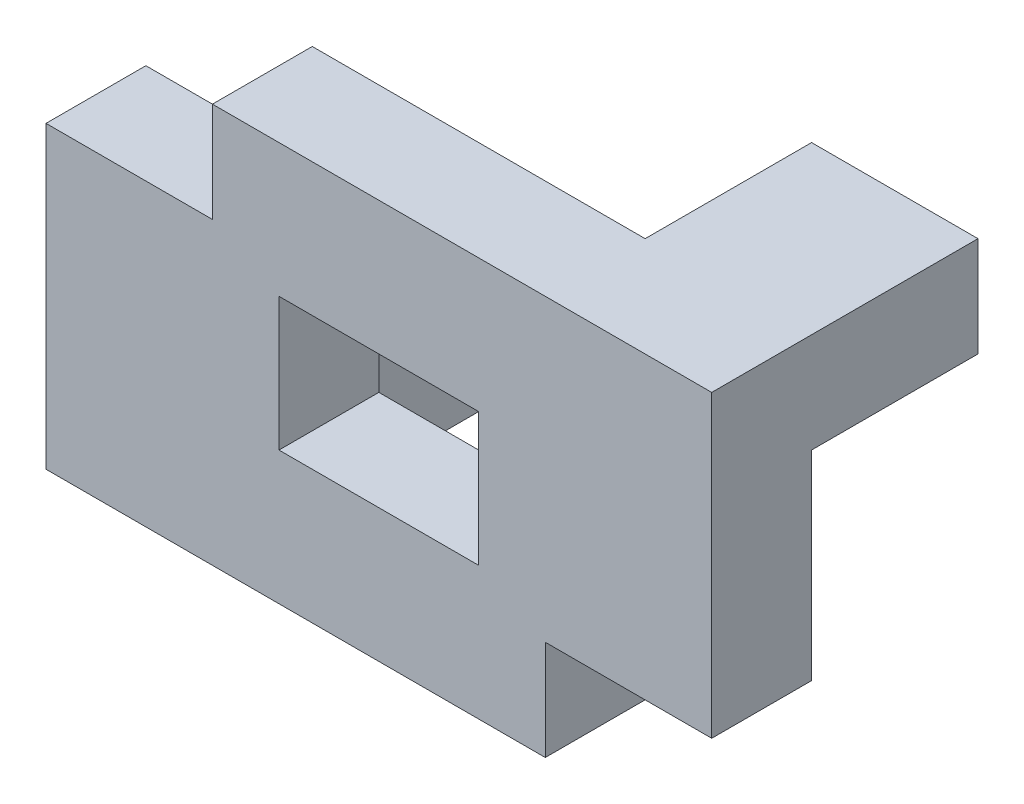
ISO-10303-21;
HEADER;
FILE_DESCRIPTION(('STEP AP214'),'2;1');
FILE_NAME('part.step','',(''),(''),'','','');
FILE_SCHEMA(('AUTOMOTIVE_DESIGN { 1 0 10303 214 1 1 1 1 }'));
ENDSEC;
DATA;
#1=APPLICATION_CONTEXT('core data for automotive mechanical design processes');
#2=APPLICATION_PROTOCOL_DEFINITION('international standard','automotive_design',2000,#1);
#3=PRODUCT_CONTEXT('',#1,'mechanical');
#4=PRODUCT('Part','Part','',(#3));
#5=PRODUCT_RELATED_PRODUCT_CATEGORY('part','',(#4));
#6=PRODUCT_DEFINITION_FORMATION('','',#4);
#7=PRODUCT_DEFINITION_CONTEXT('part definition',#1,'design');
#8=PRODUCT_DEFINITION('design','',#6,#7);
#9=PRODUCT_DEFINITION_SHAPE('','',#8);
#10=(LENGTH_UNIT() NAMED_UNIT(*) SI_UNIT(.MILLI.,.METRE.));
#11=(NAMED_UNIT(*) PLANE_ANGLE_UNIT() SI_UNIT($,.RADIAN.));
#12=(NAMED_UNIT(*) SI_UNIT($,.STERADIAN.) SOLID_ANGLE_UNIT());
#13=UNCERTAINTY_MEASURE_WITH_UNIT(LENGTH_MEASURE(1.E-05),#10,'distance_accuracy_value','');
#14=(GEOMETRIC_REPRESENTATION_CONTEXT(3) GLOBAL_UNCERTAINTY_ASSIGNED_CONTEXT((#13)) GLOBAL_UNIT_ASSIGNED_CONTEXT((#10,
#11,#12)) REPRESENTATION_CONTEXT('',''));
#15=CARTESIAN_POINT('',(0.,0.,0.));
#16=DIRECTION('',(0.,0.,1.));
#17=DIRECTION('',(1.,0.,0.));
#18=AXIS2_PLACEMENT_3D('',#15,#16,#17);
#19=CARTESIAN_POINT('',(0.,0.,0.));
#20=DIRECTION('',(0.,0.,1.));
#21=DIRECTION('',(1.,0.,0.));
#22=AXIS2_PLACEMENT_3D('',#19,#20,#21);
#23=PLANE('',#22);
#24=DIRECTION('',(-1.,0.,0.));
#25=VECTOR('',#24,1.);
#26=CARTESIAN_POINT('',(15.,-10.,0.));
#27=LINE('',#26,#25);
#28=CARTESIAN_POINT('',(15.,-10.,0.));
#29=VERTEX_POINT('',#28);
#30=CARTESIAN_POINT('',(-15.,-10.,0.));
#31=VERTEX_POINT('',#30);
#32=EDGE_CURVE('E183',#29,#31,#27,.T.);
#33=ORIENTED_EDGE('',*,*,#32,.F.);
#34=DIRECTION('',(0.,-1.,0.));
#35=VECTOR('',#34,1.);
#36=CARTESIAN_POINT('',(15.,10.,0.));
#37=LINE('',#36,#35);
#38=CARTESIAN_POINT('',(15.,10.,0.));
#39=VERTEX_POINT('',#38);
#40=EDGE_CURVE('E61',#39,#29,#37,.T.);
#41=ORIENTED_EDGE('',*,*,#40,.F.);
#42=DIRECTION('',(1.,0.,0.));
#43=VECTOR('',#42,1.);
#44=CARTESIAN_POINT('',(15.,10.,0.));
#45=LINE('',#44,#43);
#46=CARTESIAN_POINT('',(-15.,10.,0.));
#47=VERTEX_POINT('',#46);
#48=EDGE_CURVE('E190',#47,#39,#45,.T.);
#49=ORIENTED_EDGE('',*,*,#48,.F.);
#50=DIRECTION('',(0.,1.,0.));
#51=VECTOR('',#50,1.);
#52=CARTESIAN_POINT('',(-15.,10.,0.));
#53=LINE('',#52,#51);
#54=EDGE_CURVE('E173',#31,#47,#53,.T.);
#55=ORIENTED_EDGE('',*,*,#54,.F.);
#56=EDGE_LOOP('',(#33,#41,#49,#55));
#57=FACE_BOUND('',#56,.T.);
#58=DIRECTION('',(0.,-1.,0.));
#59=VECTOR('',#58,1.);
#60=CARTESIAN_POINT('',(50.,30.,0.));
#61=LINE('',#60,#59);
#62=CARTESIAN_POINT('',(50.,15.,0.));
#63=VERTEX_POINT('',#62);
#64=CARTESIAN_POINT('',(50.,-15.,0.));
#65=VERTEX_POINT('',#64);
#66=EDGE_CURVE('E327',#63,#65,#61,.T.);
#67=ORIENTED_EDGE('',*,*,#66,.T.);
#68=DIRECTION('',(1.,0.,0.));
#69=VECTOR('',#68,1.);
#70=CARTESIAN_POINT('',(50.,-15.,0.));
#71=LINE('',#70,#69);
#72=CARTESIAN_POINT('',(25.,-15.,0.));
#73=VERTEX_POINT('',#72);
#74=EDGE_CURVE('E209',#73,#65,#71,.T.);
#75=ORIENTED_EDGE('',*,*,#74,.F.);
#76=DIRECTION('',(0.,1.,0.));
#77=VECTOR('',#76,1.);
#78=CARTESIAN_POINT('',(25.,-30.,0.));
#79=LINE('',#78,#77);
#80=CARTESIAN_POINT('',(25.,-30.,0.));
#81=VERTEX_POINT('',#80);
#82=EDGE_CURVE('E205',#81,#73,#79,.T.);
#83=ORIENTED_EDGE('',*,*,#82,.F.);
#84=DIRECTION('',(1.,0.,0.));
#85=VECTOR('',#84,1.);
#86=CARTESIAN_POINT('',(-50.,-30.,0.));
#87=LINE('',#86,#85);
#88=CARTESIAN_POINT('',(-25.,-30.,0.));
#89=VERTEX_POINT('',#88);
#90=EDGE_CURVE('E323',#89,#81,#87,.T.);
#91=ORIENTED_EDGE('',*,*,#90,.F.);
#92=DIRECTION('',(0.,-1.,0.));
#93=VECTOR('',#92,1.);
#94=CARTESIAN_POINT('',(-25.,-30.,0.));
#95=LINE('',#94,#93);
#96=CARTESIAN_POINT('',(-25.,-15.,0.));
#97=VERTEX_POINT('',#96);
#98=EDGE_CURVE('E250',#97,#89,#95,.T.);
#99=ORIENTED_EDGE('',*,*,#98,.F.);
#100=DIRECTION('',(1.,0.,0.));
#101=VECTOR('',#100,1.);
#102=CARTESIAN_POINT('',(-50.,-15.,0.));
#103=LINE('',#102,#101);
#104=CARTESIAN_POINT('',(-50.,-15.,0.));
#105=VERTEX_POINT('',#104);
#106=EDGE_CURVE('E254',#105,#97,#103,.T.);
#107=ORIENTED_EDGE('',*,*,#106,.F.);
#108=DIRECTION('',(0.,-1.,0.));
#109=VECTOR('',#108,1.);
#110=CARTESIAN_POINT('',(-50.,30.,0.));
#111=LINE('',#110,#109);
#112=CARTESIAN_POINT('',(-50.,15.,0.));
#113=VERTEX_POINT('',#112);
#114=EDGE_CURVE('E304',#113,#105,#111,.T.);
#115=ORIENTED_EDGE('',*,*,#114,.F.);
#116=DIRECTION('',(-1.,0.,0.));
#117=VECTOR('',#116,1.);
#118=CARTESIAN_POINT('',(-50.,15.,0.));
#119=LINE('',#118,#117);
#120=CARTESIAN_POINT('',(-25.,15.,0.));
#121=VERTEX_POINT('',#120);
#122=EDGE_CURVE('E227',#121,#113,#119,.T.);
#123=ORIENTED_EDGE('',*,*,#122,.F.);
#124=DIRECTION('',(0.,-1.,0.));
#125=VECTOR('',#124,1.);
#126=CARTESIAN_POINT('',(-25.,30.,0.));
#127=LINE('',#126,#125);
#128=CARTESIAN_POINT('',(-25.,30.,0.));
#129=VERTEX_POINT('',#128);
#130=EDGE_CURVE('E210',#129,#121,#127,.T.);
#131=ORIENTED_EDGE('',*,*,#130,.F.);
#132=DIRECTION('',(1.,0.,0.));
#133=VECTOR('',#132,1.);
#134=CARTESIAN_POINT('',(-50.,30.,0.));
#135=LINE('',#134,#133);
#136=CARTESIAN_POINT('',(25.,30.,0.));
#137=VERTEX_POINT('',#136);
#138=EDGE_CURVE('E309',#129,#137,#135,.T.);
#139=ORIENTED_EDGE('',*,*,#138,.T.);
#140=DIRECTION('',(0.,1.,0.));
#141=VECTOR('',#140,1.);
#142=CARTESIAN_POINT('',(25.,30.,0.));
#143=LINE('',#142,#141);
#144=CARTESIAN_POINT('',(25.,15.,0.));
#145=VERTEX_POINT('',#144);
#146=EDGE_CURVE('E276',#145,#137,#143,.T.);
#147=ORIENTED_EDGE('',*,*,#146,.F.);
#148=DIRECTION('',(-1.,0.,0.));
#149=VECTOR('',#148,1.);
#150=CARTESIAN_POINT('',(50.,15.,0.));
#151=LINE('',#150,#149);
#152=EDGE_CURVE('E258',#63,#145,#151,.T.);
#153=ORIENTED_EDGE('',*,*,#152,.F.);
#154=EDGE_LOOP('',(#67,#75,#83,#91,#99,#107,#115,#123,#131,#139,#147,#153));
#155=FACE_BOUND('',#154,.T.);
#156=ADVANCED_FACE('F45',(#57,#155),#23,.F.);
#157=CARTESIAN_POINT('',(-50.,30.,15.));
#158=DIRECTION('',(1.,0.,0.));
#159=DIRECTION('',(0.,1.,0.));
#160=AXIS2_PLACEMENT_3D('',#157,#158,#159);
#161=PLANE('',#160);
#162=DIRECTION('',(0.,-1.,0.));
#163=VECTOR('',#162,1.);
#164=CARTESIAN_POINT('',(-50.,30.,15.));
#165=LINE('',#164,#163);
#166=CARTESIAN_POINT('',(-50.,15.,15.));
#167=VERTEX_POINT('',#166);
#168=CARTESIAN_POINT('',(-50.,-30.,15.));
#169=VERTEX_POINT('',#168);
#170=EDGE_CURVE('E305',#167,#169,#165,.T.);
#171=ORIENTED_EDGE('',*,*,#170,.F.);
#172=DIRECTION('',(0.,0.,-1.));
#173=VECTOR('',#172,1.);
#174=CARTESIAN_POINT('',(-50.,15.,25.));
#175=LINE('',#174,#173);
#176=EDGE_CURVE('E200',#167,#113,#175,.T.);
#177=ORIENTED_EDGE('',*,*,#176,.T.);
#178=ORIENTED_EDGE('',*,*,#114,.T.);
#179=DIRECTION('',(0.,0.,1.));
#180=VECTOR('',#179,1.);
#181=CARTESIAN_POINT('',(-50.,-15.,-25.));
#182=LINE('',#181,#180);
#183=CARTESIAN_POINT('',(-50.,-15.,-25.));
#184=VERTEX_POINT('',#183);
#185=EDGE_CURVE('E218',#184,#105,#182,.T.);
#186=ORIENTED_EDGE('',*,*,#185,.F.);
#187=DIRECTION('',(0.,1.,0.));
#188=VECTOR('',#187,1.);
#189=CARTESIAN_POINT('',(-50.,-30.,-25.));
#190=LINE('',#189,#188);
#191=CARTESIAN_POINT('',(-50.,-30.,-25.));
#192=VERTEX_POINT('',#191);
#193=EDGE_CURVE('E255',#192,#184,#190,.T.);
#194=ORIENTED_EDGE('',*,*,#193,.F.);
#195=DIRECTION('',(0.,0.,-1.));
#196=VECTOR('',#195,1.);
#197=CARTESIAN_POINT('',(-50.,-30.,15.));
#198=LINE('',#197,#196);
#199=EDGE_CURVE('E335',#169,#192,#198,.T.);
#200=ORIENTED_EDGE('',*,*,#199,.F.);
#201=EDGE_LOOP('',(#171,#177,#178,#186,#194,#200));
#202=FACE_BOUND('',#201,.T.);
#203=ADVANCED_FACE('F47',(#202),#161,.F.);
#204=CARTESIAN_POINT('',(-50.,-30.,15.));
#205=DIRECTION('',(0.,1.,0.));
#206=DIRECTION('',(0.,0.,1.));
#207=AXIS2_PLACEMENT_3D('',#204,#205,#206);
#208=PLANE('',#207);
#209=ORIENTED_EDGE('',*,*,#90,.T.);
#210=DIRECTION('',(0.,0.,-1.));
#211=VECTOR('',#210,1.);
#212=CARTESIAN_POINT('',(25.,-30.,25.));
#213=LINE('',#212,#211);
#214=CARTESIAN_POINT('',(25.,-30.,15.));
#215=VERTEX_POINT('',#214);
#216=EDGE_CURVE('E213',#215,#81,#213,.T.);
#217=ORIENTED_EDGE('',*,*,#216,.F.);
#218=DIRECTION('',(1.,0.,0.));
#219=VECTOR('',#218,1.);
#220=CARTESIAN_POINT('',(-50.,-30.,15.));
#221=LINE('',#220,#219);
#222=EDGE_CURVE('E308',#169,#215,#221,.T.);
#223=ORIENTED_EDGE('',*,*,#222,.F.);
#224=ORIENTED_EDGE('',*,*,#199,.T.);
#225=DIRECTION('',(-1.,0.,0.));
#226=VECTOR('',#225,1.);
#227=CARTESIAN_POINT('',(-50.,-30.,-25.));
#228=LINE('',#227,#226);
#229=CARTESIAN_POINT('',(-25.,-30.,-25.));
#230=VERTEX_POINT('',#229);
#231=EDGE_CURVE('E249',#230,#192,#228,.T.);
#232=ORIENTED_EDGE('',*,*,#231,.F.);
#233=DIRECTION('',(0.,0.,1.));
#234=VECTOR('',#233,1.);
#235=CARTESIAN_POINT('',(-25.,-30.,-25.));
#236=LINE('',#235,#234);
#237=EDGE_CURVE('E246',#230,#89,#236,.T.);
#238=ORIENTED_EDGE('',*,*,#237,.T.);
#239=EDGE_LOOP('',(#209,#217,#223,#224,#232,#238));
#240=FACE_BOUND('',#239,.T.);
#241=ADVANCED_FACE('F386',(#240),#208,.F.);
#242=CARTESIAN_POINT('',(50.,30.,15.));
#243=DIRECTION('',(1.,0.,0.));
#244=DIRECTION('',(0.,1.,0.));
#245=AXIS2_PLACEMENT_3D('',#242,#243,#244);
#246=PLANE('',#245);
#247=DIRECTION('',(0.,0.,-1.));
#248=VECTOR('',#247,1.);
#249=CARTESIAN_POINT('',(50.,-15.,25.));
#250=LINE('',#249,#248);
#251=CARTESIAN_POINT('',(50.,-15.,15.));
#252=VERTEX_POINT('',#251);
#253=EDGE_CURVE('E214',#252,#65,#250,.T.);
#254=ORIENTED_EDGE('',*,*,#253,.T.);
#255=ORIENTED_EDGE('',*,*,#66,.F.);
#256=DIRECTION('',(0.,0.,1.));
#257=VECTOR('',#256,1.);
#258=CARTESIAN_POINT('',(50.,15.,-25.));
#259=LINE('',#258,#257);
#260=CARTESIAN_POINT('',(50.,15.,-25.));
#261=VERTEX_POINT('',#260);
#262=EDGE_CURVE('E300',#261,#63,#259,.T.);
#263=ORIENTED_EDGE('',*,*,#262,.F.);
#264=DIRECTION('',(0.,-1.,0.));
#265=VECTOR('',#264,1.);
#266=CARTESIAN_POINT('',(50.,30.,-25.));
#267=LINE('',#266,#265);
#268=CARTESIAN_POINT('',(50.,30.,-25.));
#269=VERTEX_POINT('',#268);
#270=EDGE_CURVE('E271',#269,#261,#267,.T.);
#271=ORIENTED_EDGE('',*,*,#270,.F.);
#272=DIRECTION('',(0.,0.,-1.));
#273=VECTOR('',#272,1.);
#274=CARTESIAN_POINT('',(50.,30.,15.));
#275=LINE('',#274,#273);
#276=CARTESIAN_POINT('',(50.,30.,15.));
#277=VERTEX_POINT('',#276);
#278=EDGE_CURVE('E320',#277,#269,#275,.T.);
#279=ORIENTED_EDGE('',*,*,#278,.F.);
#280=DIRECTION('',(0.,-1.,0.));
#281=VECTOR('',#280,1.);
#282=CARTESIAN_POINT('',(50.,30.,15.));
#283=LINE('',#282,#281);
#284=EDGE_CURVE('E313',#277,#252,#283,.T.);
#285=ORIENTED_EDGE('',*,*,#284,.T.);
#286=EDGE_LOOP('',(#254,#255,#263,#271,#279,#285));
#287=FACE_BOUND('',#286,.T.);
#288=ADVANCED_FACE('F394',(#287),#246,.T.);
#289=CARTESIAN_POINT('',(-50.,30.,15.));
#290=DIRECTION('',(0.,1.,0.));
#291=DIRECTION('',(0.,0.,1.));
#292=AXIS2_PLACEMENT_3D('',#289,#290,#291);
#293=PLANE('',#292);
#294=DIRECTION('',(0.,0.,-1.));
#295=VECTOR('',#294,1.);
#296=CARTESIAN_POINT('',(-25.,30.,25.));
#297=LINE('',#296,#295);
#298=CARTESIAN_POINT('',(-25.,30.,15.));
#299=VERTEX_POINT('',#298);
#300=EDGE_CURVE('E224',#299,#129,#297,.T.);
#301=ORIENTED_EDGE('',*,*,#300,.F.);
#302=DIRECTION('',(1.,0.,0.));
#303=VECTOR('',#302,1.);
#304=CARTESIAN_POINT('',(-50.,30.,15.));
#305=LINE('',#304,#303);
#306=EDGE_CURVE('E317',#299,#277,#305,.T.);
#307=ORIENTED_EDGE('',*,*,#306,.T.);
#308=ORIENTED_EDGE('',*,*,#278,.T.);
#309=DIRECTION('',(1.,0.,0.));
#310=VECTOR('',#309,1.);
#311=CARTESIAN_POINT('',(50.,30.,-25.));
#312=LINE('',#311,#310);
#313=CARTESIAN_POINT('',(25.,30.,-25.));
#314=VERTEX_POINT('',#313);
#315=EDGE_CURVE('E282',#314,#269,#312,.T.);
#316=ORIENTED_EDGE('',*,*,#315,.F.);
#317=DIRECTION('',(0.,0.,1.));
#318=VECTOR('',#317,1.);
#319=CARTESIAN_POINT('',(25.,30.,-25.));
#320=LINE('',#319,#318);
#321=EDGE_CURVE('E286',#314,#137,#320,.T.);
#322=ORIENTED_EDGE('',*,*,#321,.T.);
#323=ORIENTED_EDGE('',*,*,#138,.F.);
#324=EDGE_LOOP('',(#301,#307,#308,#316,#322,#323));
#325=FACE_BOUND('',#324,.T.);
#326=ADVANCED_FACE('F391',(#325),#293,.T.);
#327=CARTESIAN_POINT('',(0.,0.,15.));
#328=DIRECTION('',(0.,0.,1.));
#329=DIRECTION('',(1.,0.,0.));
#330=AXIS2_PLACEMENT_3D('',#327,#328,#329);
#331=PLANE('',#330);
#332=DIRECTION('',(0.,1.,0.));
#333=VECTOR('',#332,1.);
#334=CARTESIAN_POINT('',(15.,0.,15.));
#335=LINE('',#334,#333);
#336=CARTESIAN_POINT('',(15.,-10.,15.));
#337=VERTEX_POINT('',#336);
#338=CARTESIAN_POINT('',(15.,10.,15.));
#339=VERTEX_POINT('',#338);
#340=EDGE_CURVE('E11',#337,#339,#335,.T.);
#341=ORIENTED_EDGE('',*,*,#340,.F.);
#342=DIRECTION('',(1.,0.,0.));
#343=VECTOR('',#342,1.);
#344=CARTESIAN_POINT('',(0.,-10.,15.));
#345=LINE('',#344,#343);
#346=CARTESIAN_POINT('',(-15.,-10.,15.));
#347=VERTEX_POINT('',#346);
#348=EDGE_CURVE('E352',#347,#337,#345,.T.);
#349=ORIENTED_EDGE('',*,*,#348,.F.);
#350=DIRECTION('',(0.,-1.,0.));
#351=VECTOR('',#350,1.);
#352=CARTESIAN_POINT('',(-15.,0.,15.));
#353=LINE('',#352,#351);
#354=CARTESIAN_POINT('',(-15.,10.,15.));
#355=VERTEX_POINT('',#354);
#356=EDGE_CURVE('E176',#355,#347,#353,.T.);
#357=ORIENTED_EDGE('',*,*,#356,.F.);
#358=DIRECTION('',(-1.,0.,0.));
#359=VECTOR('',#358,1.);
#360=CARTESIAN_POINT('',(0.,10.,15.));
#361=LINE('',#360,#359);
#362=EDGE_CURVE('E54',#339,#355,#361,.T.);
#363=ORIENTED_EDGE('',*,*,#362,.F.);
#364=EDGE_LOOP('',(#341,#349,#357,#363));
#365=FACE_BOUND('',#364,.T.);
#366=DIRECTION('',(-1.,0.,0.));
#367=VECTOR('',#366,1.);
#368=CARTESIAN_POINT('',(0.,-15.,15.));
#369=LINE('',#368,#367);
#370=CARTESIAN_POINT('',(25.,-15.,15.));
#371=VERTEX_POINT('',#370);
#372=EDGE_CURVE('E348',#252,#371,#369,.T.);
#373=ORIENTED_EDGE('',*,*,#372,.F.);
#374=ORIENTED_EDGE('',*,*,#284,.F.);
#375=ORIENTED_EDGE('',*,*,#306,.F.);
#376=DIRECTION('',(0.,1.,0.));
#377=VECTOR('',#376,1.);
#378=CARTESIAN_POINT('',(-25.,0.,15.));
#379=LINE('',#378,#377);
#380=CARTESIAN_POINT('',(-25.,15.,15.));
#381=VERTEX_POINT('',#380);
#382=EDGE_CURVE('E338',#381,#299,#379,.T.);
#383=ORIENTED_EDGE('',*,*,#382,.F.);
#384=DIRECTION('',(1.,0.,0.));
#385=VECTOR('',#384,1.);
#386=CARTESIAN_POINT('',(0.,15.,15.));
#387=LINE('',#386,#385);
#388=EDGE_CURVE('E341',#167,#381,#387,.T.);
#389=ORIENTED_EDGE('',*,*,#388,.F.);
#390=ORIENTED_EDGE('',*,*,#170,.T.);
#391=ORIENTED_EDGE('',*,*,#222,.T.);
#392=DIRECTION('',(0.,-1.,0.));
#393=VECTOR('',#392,1.);
#394=CARTESIAN_POINT('',(25.,0.,15.));
#395=LINE('',#394,#393);
#396=EDGE_CURVE('E345',#371,#215,#395,.T.);
#397=ORIENTED_EDGE('',*,*,#396,.F.);
#398=EDGE_LOOP('',(#373,#374,#375,#383,#389,#390,#391,#397));
#399=FACE_BOUND('',#398,.T.);
#400=ADVANCED_FACE('F363',(#365,#399),#331,.T.);
#401=CARTESIAN_POINT('',(50.,15.,-25.));
#402=DIRECTION('',(0.,1.,0.));
#403=DIRECTION('',(0.,0.,1.));
#404=AXIS2_PLACEMENT_3D('',#401,#402,#403);
#405=PLANE('',#404);
#406=ORIENTED_EDGE('',*,*,#152,.T.);
#407=DIRECTION('',(0.,0.,1.));
#408=VECTOR('',#407,1.);
#409=CARTESIAN_POINT('',(25.,15.,-25.));
#410=LINE('',#409,#408);
#411=CARTESIAN_POINT('',(25.,15.,-25.));
#412=VERTEX_POINT('',#411);
#413=EDGE_CURVE('E296',#412,#145,#410,.T.);
#414=ORIENTED_EDGE('',*,*,#413,.F.);
#415=DIRECTION('',(-1.,0.,0.));
#416=VECTOR('',#415,1.);
#417=CARTESIAN_POINT('',(50.,15.,-25.));
#418=LINE('',#417,#416);
#419=EDGE_CURVE('E275',#261,#412,#418,.T.);
#420=ORIENTED_EDGE('',*,*,#419,.F.);
#421=ORIENTED_EDGE('',*,*,#262,.T.);
#422=EDGE_LOOP('',(#406,#414,#420,#421));
#423=FACE_BOUND('',#422,.T.);
#424=ADVANCED_FACE('F446',(#423),#405,.F.);
#425=CARTESIAN_POINT('',(25.,30.,-25.));
#426=DIRECTION('',(1.,0.,0.));
#427=DIRECTION('',(0.,1.,0.));
#428=AXIS2_PLACEMENT_3D('',#425,#426,#427);
#429=PLANE('',#428);
#430=ORIENTED_EDGE('',*,*,#146,.T.);
#431=ORIENTED_EDGE('',*,*,#321,.F.);
#432=DIRECTION('',(0.,1.,0.));
#433=VECTOR('',#432,1.);
#434=CARTESIAN_POINT('',(25.,30.,-25.));
#435=LINE('',#434,#433);
#436=EDGE_CURVE('E279',#412,#314,#435,.T.);
#437=ORIENTED_EDGE('',*,*,#436,.F.);
#438=ORIENTED_EDGE('',*,*,#413,.T.);
#439=EDGE_LOOP('',(#430,#431,#437,#438));
#440=FACE_BOUND('',#439,.T.);
#441=ADVANCED_FACE('F442',(#440),#429,.F.);
#442=CARTESIAN_POINT('',(0.,0.,-25.));
#443=DIRECTION('',(0.,0.,-1.));
#444=DIRECTION('',(-1.,0.,0.));
#445=AXIS2_PLACEMENT_3D('',#442,#443,#444);
#446=PLANE('',#445);
#447=ORIENTED_EDGE('',*,*,#270,.T.);
#448=ORIENTED_EDGE('',*,*,#419,.T.);
#449=ORIENTED_EDGE('',*,*,#436,.T.);
#450=ORIENTED_EDGE('',*,*,#315,.T.);
#451=EDGE_LOOP('',(#447,#448,#449,#450));
#452=FACE_BOUND('',#451,.T.);
#453=ADVANCED_FACE('F461',(#452),#446,.T.);
#454=CARTESIAN_POINT('',(-50.,-15.,-25.));
#455=DIRECTION('',(0.,-1.,0.));
#456=DIRECTION('',(1.,0.,0.));
#457=AXIS2_PLACEMENT_3D('',#454,#455,#456);
#458=PLANE('',#457);
#459=ORIENTED_EDGE('',*,*,#106,.T.);
#460=DIRECTION('',(0.,0.,1.));
#461=VECTOR('',#460,1.);
#462=CARTESIAN_POINT('',(-25.,-15.,-25.));
#463=LINE('',#462,#461);
#464=CARTESIAN_POINT('',(-25.,-15.,-25.));
#465=VERTEX_POINT('',#464);
#466=EDGE_CURVE('E242',#465,#97,#463,.T.);
#467=ORIENTED_EDGE('',*,*,#466,.F.);
#468=DIRECTION('',(1.,0.,0.));
#469=VECTOR('',#468,1.);
#470=CARTESIAN_POINT('',(-50.,-15.,-25.));
#471=LINE('',#470,#469);
#472=EDGE_CURVE('E265',#184,#465,#471,.T.);
#473=ORIENTED_EDGE('',*,*,#472,.F.);
#474=ORIENTED_EDGE('',*,*,#185,.T.);
#475=EDGE_LOOP('',(#459,#467,#473,#474));
#476=FACE_BOUND('',#475,.T.);
#477=ADVANCED_FACE('F426',(#476),#458,.F.);
#478=CARTESIAN_POINT('',(-25.,-30.,-25.));
#479=DIRECTION('',(-1.,0.,0.));
#480=DIRECTION('',(0.,0.,1.));
#481=AXIS2_PLACEMENT_3D('',#478,#479,#480);
#482=PLANE('',#481);
#483=ORIENTED_EDGE('',*,*,#98,.T.);
#484=ORIENTED_EDGE('',*,*,#237,.F.);
#485=DIRECTION('',(0.,-1.,0.));
#486=VECTOR('',#485,1.);
#487=CARTESIAN_POINT('',(-25.,-30.,-25.));
#488=LINE('',#487,#486);
#489=EDGE_CURVE('E262',#465,#230,#488,.T.);
#490=ORIENTED_EDGE('',*,*,#489,.F.);
#491=ORIENTED_EDGE('',*,*,#466,.T.);
#492=EDGE_LOOP('',(#483,#484,#490,#491));
#493=FACE_BOUND('',#492,.T.);
#494=ADVANCED_FACE('F424',(#493),#482,.F.);
#495=CARTESIAN_POINT('',(0.,0.,-25.));
#496=DIRECTION('',(0.,0.,-1.));
#497=DIRECTION('',(-1.,0.,0.));
#498=AXIS2_PLACEMENT_3D('',#495,#496,#497);
#499=PLANE('',#498);
#500=ORIENTED_EDGE('',*,*,#193,.T.);
#501=ORIENTED_EDGE('',*,*,#472,.T.);
#502=ORIENTED_EDGE('',*,*,#489,.T.);
#503=ORIENTED_EDGE('',*,*,#231,.T.);
#504=EDGE_LOOP('',(#500,#501,#502,#503));
#505=FACE_BOUND('',#504,.T.);
#506=ADVANCED_FACE('F420',(#505),#499,.T.);
#507=CARTESIAN_POINT('',(-50.,15.,25.));
#508=DIRECTION('',(0.,-1.,0.));
#509=DIRECTION('',(1.,0.,0.));
#510=AXIS2_PLACEMENT_3D('',#507,#508,#509);
#511=PLANE('',#510);
#512=ORIENTED_EDGE('',*,*,#388,.T.);
#513=DIRECTION('',(0.,0.,-1.));
#514=VECTOR('',#513,1.);
#515=CARTESIAN_POINT('',(-25.,15.,25.));
#516=LINE('',#515,#514);
#517=EDGE_CURVE('E228',#381,#121,#516,.T.);
#518=ORIENTED_EDGE('',*,*,#517,.T.);
#519=ORIENTED_EDGE('',*,*,#122,.T.);
#520=ORIENTED_EDGE('',*,*,#176,.F.);
#521=EDGE_LOOP('',(#512,#518,#519,#520));
#522=FACE_BOUND('',#521,.T.);
#523=ADVANCED_FACE('F431',(#522),#511,.F.);
#524=CARTESIAN_POINT('',(-25.,30.,25.));
#525=DIRECTION('',(1.,0.,0.));
#526=DIRECTION('',(0.,0.,-1.));
#527=AXIS2_PLACEMENT_3D('',#524,#525,#526);
#528=PLANE('',#527);
#529=ORIENTED_EDGE('',*,*,#382,.T.);
#530=ORIENTED_EDGE('',*,*,#300,.T.);
#531=ORIENTED_EDGE('',*,*,#130,.T.);
#532=ORIENTED_EDGE('',*,*,#517,.F.);
#533=EDGE_LOOP('',(#529,#530,#531,#532));
#534=FACE_BOUND('',#533,.T.);
#535=ADVANCED_FACE('F436',(#534),#528,.F.);
#536=CARTESIAN_POINT('',(50.,-15.,25.));
#537=DIRECTION('',(0.,1.,0.));
#538=DIRECTION('',(0.,0.,1.));
#539=AXIS2_PLACEMENT_3D('',#536,#537,#538);
#540=PLANE('',#539);
#541=ORIENTED_EDGE('',*,*,#372,.T.);
#542=DIRECTION('',(0.,0.,-1.));
#543=VECTOR('',#542,1.);
#544=CARTESIAN_POINT('',(25.,-15.,25.));
#545=LINE('',#544,#543);
#546=EDGE_CURVE('E219',#371,#73,#545,.T.);
#547=ORIENTED_EDGE('',*,*,#546,.T.);
#548=ORIENTED_EDGE('',*,*,#74,.T.);
#549=ORIENTED_EDGE('',*,*,#253,.F.);
#550=EDGE_LOOP('',(#541,#547,#548,#549));
#551=FACE_BOUND('',#550,.T.);
#552=ADVANCED_FACE('F376',(#551),#540,.F.);
#553=CARTESIAN_POINT('',(25.,-30.,25.));
#554=DIRECTION('',(-1.,0.,0.));
#555=DIRECTION('',(0.,0.,1.));
#556=AXIS2_PLACEMENT_3D('',#553,#554,#555);
#557=PLANE('',#556);
#558=ORIENTED_EDGE('',*,*,#396,.T.);
#559=ORIENTED_EDGE('',*,*,#216,.T.);
#560=ORIENTED_EDGE('',*,*,#82,.T.);
#561=ORIENTED_EDGE('',*,*,#546,.F.);
#562=EDGE_LOOP('',(#558,#559,#560,#561));
#563=FACE_BOUND('',#562,.T.);
#564=ADVANCED_FACE('F368',(#563),#557,.F.);
#565=CARTESIAN_POINT('',(15.,10.,25.));
#566=DIRECTION('',(1.,0.,0.));
#567=DIRECTION('',(0.,1.,0.));
#568=AXIS2_PLACEMENT_3D('',#565,#566,#567);
#569=PLANE('',#568);
#570=ORIENTED_EDGE('',*,*,#340,.T.);
#571=DIRECTION('',(0.,0.,-1.));
#572=VECTOR('',#571,1.);
#573=CARTESIAN_POINT('',(15.,10.,25.));
#574=LINE('',#573,#572);
#575=EDGE_CURVE('E197',#339,#39,#574,.T.);
#576=ORIENTED_EDGE('',*,*,#575,.T.);
#577=ORIENTED_EDGE('',*,*,#40,.T.);
#578=DIRECTION('',(0.,0.,-1.));
#579=VECTOR('',#578,1.);
#580=CARTESIAN_POINT('',(15.,-10.,25.));
#581=LINE('',#580,#579);
#582=EDGE_CURVE('E180',#337,#29,#581,.T.);
#583=ORIENTED_EDGE('',*,*,#582,.F.);
#584=EDGE_LOOP('',(#570,#576,#577,#583));
#585=FACE_BOUND('',#584,.T.);
#586=ADVANCED_FACE('F365',(#585),#569,.F.);
#587=CARTESIAN_POINT('',(15.,10.,25.));
#588=DIRECTION('',(0.,1.,0.));
#589=DIRECTION('',(0.,0.,1.));
#590=AXIS2_PLACEMENT_3D('',#587,#588,#589);
#591=PLANE('',#590);
#592=ORIENTED_EDGE('',*,*,#362,.T.);
#593=DIRECTION('',(0.,0.,-1.));
#594=VECTOR('',#593,1.);
#595=CARTESIAN_POINT('',(-15.,10.,25.));
#596=LINE('',#595,#594);
#597=EDGE_CURVE('E179',#355,#47,#596,.T.);
#598=ORIENTED_EDGE('',*,*,#597,.T.);
#599=ORIENTED_EDGE('',*,*,#48,.T.);
#600=ORIENTED_EDGE('',*,*,#575,.F.);
#601=EDGE_LOOP('',(#592,#598,#599,#600));
#602=FACE_BOUND('',#601,.T.);
#603=ADVANCED_FACE('F360',(#602),#591,.F.);
#604=CARTESIAN_POINT('',(-15.,10.,25.));
#605=DIRECTION('',(-1.,0.,0.));
#606=DIRECTION('',(0.,-1.,0.));
#607=AXIS2_PLACEMENT_3D('',#604,#605,#606);
#608=PLANE('',#607);
#609=ORIENTED_EDGE('',*,*,#356,.T.);
#610=DIRECTION('',(0.,0.,-1.));
#611=VECTOR('',#610,1.);
#612=CARTESIAN_POINT('',(-15.,-10.,25.));
#613=LINE('',#612,#611);
#614=EDGE_CURVE('E69',#347,#31,#613,.T.);
#615=ORIENTED_EDGE('',*,*,#614,.T.);
#616=ORIENTED_EDGE('',*,*,#54,.T.);
#617=ORIENTED_EDGE('',*,*,#597,.F.);
#618=EDGE_LOOP('',(#609,#615,#616,#617));
#619=FACE_BOUND('',#618,.T.);
#620=ADVANCED_FACE('F170',(#619),#608,.F.);
#621=CARTESIAN_POINT('',(15.,-10.,25.));
#622=DIRECTION('',(0.,-1.,0.));
#623=DIRECTION('',(0.,0.,-1.));
#624=AXIS2_PLACEMENT_3D('',#621,#622,#623);
#625=PLANE('',#624);
#626=ORIENTED_EDGE('',*,*,#348,.T.);
#627=ORIENTED_EDGE('',*,*,#582,.T.);
#628=ORIENTED_EDGE('',*,*,#32,.T.);
#629=ORIENTED_EDGE('',*,*,#614,.F.);
#630=EDGE_LOOP('',(#626,#627,#628,#629));
#631=FACE_BOUND('',#630,.T.);
#632=ADVANCED_FACE('F184',(#631),#625,.F.);
#633=CLOSED_SHELL('',(#156,#203,#241,#288,#326,#400,#424,#441,#453,#477,#494,#506,#523,#535,
#552,#564,#586,#603,#620,#632));
#634=MANIFOLD_SOLID_BREP('B2',#633);
#635=ADVANCED_BREP_SHAPE_REPRESENTATION('',(#18,#634),#14);
#636=SHAPE_DEFINITION_REPRESENTATION(#9,#635);
ENDSEC;
END-ISO-10303-21;
